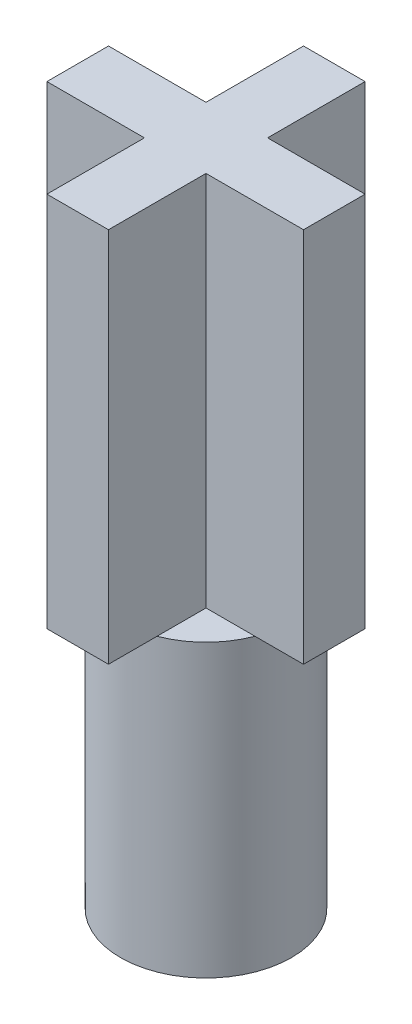
ISO-10303-21;
HEADER;
FILE_DESCRIPTION(('STEP AP214'),'2;1');
FILE_NAME('part.step','',(''),(''),'','','');
FILE_SCHEMA(('AUTOMOTIVE_DESIGN { 1 0 10303 214 1 1 1 1 }'));
ENDSEC;
DATA;
#1=APPLICATION_CONTEXT('core data for automotive mechanical design processes');
#2=APPLICATION_PROTOCOL_DEFINITION('international standard','automotive_design',2000,#1);
#3=PRODUCT_CONTEXT('',#1,'mechanical');
#4=PRODUCT('Part','Part','',(#3));
#5=PRODUCT_RELATED_PRODUCT_CATEGORY('part','',(#4));
#6=PRODUCT_DEFINITION_FORMATION('','',#4);
#7=PRODUCT_DEFINITION_CONTEXT('part definition',#1,'design');
#8=PRODUCT_DEFINITION('design','',#6,#7);
#9=PRODUCT_DEFINITION_SHAPE('','',#8);
#10=(LENGTH_UNIT() NAMED_UNIT(*) SI_UNIT(.MILLI.,.METRE.));
#11=(NAMED_UNIT(*) PLANE_ANGLE_UNIT() SI_UNIT($,.RADIAN.));
#12=(NAMED_UNIT(*) SI_UNIT($,.STERADIAN.) SOLID_ANGLE_UNIT());
#13=UNCERTAINTY_MEASURE_WITH_UNIT(LENGTH_MEASURE(1.E-05),#10,'distance_accuracy_value','');
#14=(GEOMETRIC_REPRESENTATION_CONTEXT(3) GLOBAL_UNCERTAINTY_ASSIGNED_CONTEXT((#13)) GLOBAL_UNIT_ASSIGNED_CONTEXT((#10,
#11,#12)) REPRESENTATION_CONTEXT('',''));
#15=CARTESIAN_POINT('',(0.,0.,0.));
#16=DIRECTION('',(0.,0.,1.));
#17=DIRECTION('',(1.,0.,0.));
#18=AXIS2_PLACEMENT_3D('',#15,#16,#17);
#19=CARTESIAN_POINT('',(0.,17.,0.));
#20=DIRECTION('',(0.,1.,0.));
#21=DIRECTION('',(0.,0.,1.));
#22=AXIS2_PLACEMENT_3D('',#19,#20,#21);
#23=PLANE('',#22);
#24=DIRECTION('',(-1.,0.,0.));
#25=VECTOR('',#24,1.);
#26=CARTESIAN_POINT('',(-1.8,17.,-1.8));
#27=LINE('',#26,#25);
#28=CARTESIAN_POINT('',(-1.8,17.,-1.8));
#29=VERTEX_POINT('',#28);
#30=CARTESIAN_POINT('',(-4.32900489238578,17.,-1.8));
#31=VERTEX_POINT('',#30);
#32=EDGE_CURVE('E57',#29,#31,#27,.T.);
#33=ORIENTED_EDGE('',*,*,#32,.F.);
#34=DIRECTION('',(0.,0.,1.));
#35=VECTOR('',#34,1.);
#36=CARTESIAN_POINT('',(-1.8,17.,-1.8));
#37=LINE('',#36,#35);
#38=CARTESIAN_POINT('',(-1.8,17.,-4.66476151587624));
#39=VERTEX_POINT('',#38);
#40=EDGE_CURVE('E11',#39,#29,#37,.T.);
#41=ORIENTED_EDGE('',*,*,#40,.F.);
#42=CARTESIAN_POINT('',(0.,17.,0.));
#43=DIRECTION('',(0.,1.,0.));
#44=DIRECTION('',(0.,0.,1.));
#45=AXIS2_PLACEMENT_3D('',#42,#43,#44);
#46=CIRCLE('',#45,5.);
#47=CARTESIAN_POINT('',(-4.32900489238578,17.,-2.50194257362154));
#48=VERTEX_POINT('',#47);
#49=EDGE_CURVE('E206',#39,#48,#46,.T.);
#50=ORIENTED_EDGE('',*,*,#49,.T.);
#51=DIRECTION('',(0.,0.,1.));
#52=VECTOR('',#51,1.);
#53=CARTESIAN_POINT('',(-4.32900489238578,17.,-2.50194257362154));
#54=LINE('',#53,#52);
#55=EDGE_CURVE('E217',#48,#31,#54,.T.);
#56=ORIENTED_EDGE('',*,*,#55,.T.);
#57=EDGE_LOOP('',(#33,#41,#50,#56));
#58=FACE_BOUND('',#57,.T.);
#59=ADVANCED_FACE('F39',(#58),#23,.T.);
#60=DIRECTION('',(0.,0.,-1.));
#61=VECTOR('',#60,1.);
#62=CARTESIAN_POINT('',(1.8,17.,-7.5));
#63=LINE('',#62,#61);
#64=CARTESIAN_POINT('',(1.8,17.,-1.8));
#65=VERTEX_POINT('',#64);
#66=CARTESIAN_POINT('',(1.8,17.,-4.66476151587624));
#67=VERTEX_POINT('',#66);
#68=EDGE_CURVE('E64',#65,#67,#63,.T.);
#69=ORIENTED_EDGE('',*,*,#68,.F.);
#70=DIRECTION('',(-1.,0.,0.));
#71=VECTOR('',#70,1.);
#72=CARTESIAN_POINT('',(7.5,17.,-1.8));
#73=LINE('',#72,#71);
#74=CARTESIAN_POINT('',(4.66476151587624,17.,-1.8));
#75=VERTEX_POINT('',#74);
#76=EDGE_CURVE('E48',#75,#65,#73,.T.);
#77=ORIENTED_EDGE('',*,*,#76,.F.);
#78=EDGE_CURVE('E364',#75,#67,#46,.T.);
#79=ORIENTED_EDGE('',*,*,#78,.T.);
#80=EDGE_LOOP('',(#69,#77,#79));
#81=FACE_BOUND('',#80,.T.);
#82=ADVANCED_FACE('F402',(#81),#23,.T.);
#83=DIRECTION('',(1.,0.,0.));
#84=VECTOR('',#83,1.);
#85=CARTESIAN_POINT('',(1.8,17.,1.8));
#86=LINE('',#85,#84);
#87=CARTESIAN_POINT('',(1.8,17.,1.8));
#88=VERTEX_POINT('',#87);
#89=CARTESIAN_POINT('',(4.66476151587624,17.,1.8));
#90=VERTEX_POINT('',#89);
#91=EDGE_CURVE('E303',#88,#90,#86,.T.);
#92=ORIENTED_EDGE('',*,*,#91,.F.);
#93=DIRECTION('',(0.,0.,-1.));
#94=VECTOR('',#93,1.);
#95=CARTESIAN_POINT('',(1.8,17.,1.8));
#96=LINE('',#95,#94);
#97=CARTESIAN_POINT('',(1.8,17.,4.66476151587624));
#98=VERTEX_POINT('',#97);
#99=EDGE_CURVE('E287',#98,#88,#96,.T.);
#100=ORIENTED_EDGE('',*,*,#99,.F.);
#101=EDGE_CURVE('E358',#98,#90,#46,.T.);
#102=ORIENTED_EDGE('',*,*,#101,.T.);
#103=EDGE_LOOP('',(#92,#100,#102));
#104=FACE_BOUND('',#103,.T.);
#105=ADVANCED_FACE('F400',(#104),#23,.T.);
#106=CARTESIAN_POINT('',(-4.32900489238578,15.,0.));
#107=DIRECTION('',(1.,0.,0.));
#108=DIRECTION('',(0.,0.,-1.));
#109=AXIS2_PLACEMENT_3D('',#106,#107,#108);
#110=PLANE('',#109);
#111=DIRECTION('',(0.,0.,1.));
#112=VECTOR('',#111,1.);
#113=CARTESIAN_POINT('',(-4.32900489238578,0.,0.));
#114=LINE('',#113,#112);
#115=CARTESIAN_POINT('',(-4.32900489238578,0.,-2.50194257362154));
#116=VERTEX_POINT('',#115);
#117=CARTESIAN_POINT('',(-4.32900489238578,0.,2.50194257362154));
#118=VERTEX_POINT('',#117);
#119=EDGE_CURVE('E234',#116,#118,#114,.T.);
#120=ORIENTED_EDGE('',*,*,#119,.T.);
#121=DIRECTION('',(0.,-1.,0.));
#122=VECTOR('',#121,1.);
#123=CARTESIAN_POINT('',(-4.32900489238578,15.,2.50194257362154));
#124=LINE('',#123,#122);
#125=CARTESIAN_POINT('',(-4.32900489238578,17.,2.50194257362154));
#126=VERTEX_POINT('',#125);
#127=EDGE_CURVE('E241',#126,#118,#124,.T.);
#128=ORIENTED_EDGE('',*,*,#127,.F.);
#129=CARTESIAN_POINT('',(-4.32900489238578,17.,1.8));
#130=VERTEX_POINT('',#129);
#131=EDGE_CURVE('E215',#130,#126,#54,.T.);
#132=ORIENTED_EDGE('',*,*,#131,.F.);
#133=EDGE_CURVE('E220',#31,#130,#54,.T.);
#134=ORIENTED_EDGE('',*,*,#133,.F.);
#135=ORIENTED_EDGE('',*,*,#55,.F.);
#136=DIRECTION('',(0.,-1.,0.));
#137=VECTOR('',#136,1.);
#138=CARTESIAN_POINT('',(-4.32900489238578,15.,-2.50194257362154));
#139=LINE('',#138,#137);
#140=EDGE_CURVE('E238',#48,#116,#139,.T.);
#141=ORIENTED_EDGE('',*,*,#140,.T.);
#142=EDGE_LOOP('',(#120,#128,#132,#134,#135,#141));
#143=FACE_BOUND('',#142,.T.);
#144=ADVANCED_FACE('F261',(#143),#110,.F.);
#145=CARTESIAN_POINT('',(0.,15.,0.));
#146=DIRECTION('',(0.,-1.,0.));
#147=DIRECTION('',(0.,0.,-1.));
#148=AXIS2_PLACEMENT_3D('',#145,#146,#147);
#149=CYLINDRICAL_SURFACE('',#148,2.65);
#150=CARTESIAN_POINT('',(0.,0.,0.));
#151=DIRECTION('',(0.,1.,0.));
#152=DIRECTION('',(0.,0.,1.));
#153=AXIS2_PLACEMENT_3D('',#150,#151,#152);
#154=CIRCLE('',#153,2.65);
#155=CARTESIAN_POINT('',(-1.47222222222222,0.,2.20342046110021));
#156=VERTEX_POINT('',#155);
#157=CARTESIAN_POINT('',(-1.47222222222222,0.,-2.20342046110021));
#158=VERTEX_POINT('',#157);
#159=EDGE_CURVE('E219',#156,#158,#154,.T.);
#160=ORIENTED_EDGE('',*,*,#159,.F.);
#161=DIRECTION('',(0.,-1.,0.));
#162=VECTOR('',#161,1.);
#163=CARTESIAN_POINT('',(-1.47222222222222,15.,2.20342046110021));
#164=LINE('',#163,#162);
#165=CARTESIAN_POINT('',(-1.47222222222222,15.,2.20342046110021));
#166=VERTEX_POINT('',#165);
#167=EDGE_CURVE('E43',#166,#156,#164,.T.);
#168=ORIENTED_EDGE('',*,*,#167,.F.);
#169=CARTESIAN_POINT('',(0.,15.,0.));
#170=DIRECTION('',(0.,1.,0.));
#171=DIRECTION('',(0.,0.,1.));
#172=AXIS2_PLACEMENT_3D('',#169,#170,#171);
#173=CIRCLE('',#172,2.65);
#174=CARTESIAN_POINT('',(-1.47222222222222,15.,-2.20342046110021));
#175=VERTEX_POINT('',#174);
#176=EDGE_CURVE('E221',#166,#175,#173,.T.);
#177=ORIENTED_EDGE('',*,*,#176,.T.);
#178=DIRECTION('',(0.,-1.,0.));
#179=VECTOR('',#178,1.);
#180=CARTESIAN_POINT('',(-1.47222222222222,15.,-2.20342046110021));
#181=LINE('',#180,#179);
#182=EDGE_CURVE('E228',#175,#158,#181,.T.);
#183=ORIENTED_EDGE('',*,*,#182,.T.);
#184=EDGE_LOOP('',(#160,#168,#177,#183));
#185=FACE_BOUND('',#184,.T.);
#186=ADVANCED_FACE('F41',(#185),#149,.F.);
#187=CARTESIAN_POINT('',(-1.47222222222222,15.,0.));
#188=DIRECTION('',(1.,0.,0.));
#189=DIRECTION('',(0.,0.,-1.));
#190=AXIS2_PLACEMENT_3D('',#187,#188,#189);
#191=PLANE('',#190);
#192=DIRECTION('',(0.,0.,1.));
#193=VECTOR('',#192,1.);
#194=CARTESIAN_POINT('',(-1.47222222222222,0.,0.));
#195=LINE('',#194,#193);
#196=EDGE_CURVE('E231',#158,#156,#195,.T.);
#197=ORIENTED_EDGE('',*,*,#196,.F.);
#198=ORIENTED_EDGE('',*,*,#182,.F.);
#199=DIRECTION('',(0.,0.,1.));
#200=VECTOR('',#199,1.);
#201=CARTESIAN_POINT('',(-1.47222222222222,15.,0.));
#202=LINE('',#201,#200);
#203=EDGE_CURVE('E224',#175,#166,#202,.T.);
#204=ORIENTED_EDGE('',*,*,#203,.T.);
#205=ORIENTED_EDGE('',*,*,#167,.T.);
#206=EDGE_LOOP('',(#197,#198,#204,#205));
#207=FACE_BOUND('',#206,.T.);
#208=ADVANCED_FACE('F250',(#207),#191,.T.);
#209=CARTESIAN_POINT('',(0.,15.,0.));
#210=DIRECTION('',(0.,-1.,0.));
#211=DIRECTION('',(0.,0.,-1.));
#212=AXIS2_PLACEMENT_3D('',#209,#210,#211);
#213=CYLINDRICAL_SURFACE('',#212,5.);
#214=CARTESIAN_POINT('',(0.,0.,0.));
#215=DIRECTION('',(0.,1.,0.));
#216=DIRECTION('',(0.,0.,1.));
#217=AXIS2_PLACEMENT_3D('',#214,#215,#216);
#218=CIRCLE('',#217,5.);
#219=EDGE_CURVE('E225',#118,#116,#218,.T.);
#220=ORIENTED_EDGE('',*,*,#219,.T.);
#221=ORIENTED_EDGE('',*,*,#140,.F.);
#222=ORIENTED_EDGE('',*,*,#49,.F.);
#223=EDGE_CURVE('E208',#67,#39,#46,.T.);
#224=ORIENTED_EDGE('',*,*,#223,.F.);
#225=ORIENTED_EDGE('',*,*,#78,.F.);
#226=EDGE_CURVE('E360',#90,#75,#46,.T.);
#227=ORIENTED_EDGE('',*,*,#226,.F.);
#228=ORIENTED_EDGE('',*,*,#101,.F.);
#229=CARTESIAN_POINT('',(-1.8,17.,4.66476151587624));
#230=VERTEX_POINT('',#229);
#231=EDGE_CURVE('E216',#230,#98,#46,.T.);
#232=ORIENTED_EDGE('',*,*,#231,.F.);
#233=EDGE_CURVE('E210',#126,#230,#46,.T.);
#234=ORIENTED_EDGE('',*,*,#233,.F.);
#235=ORIENTED_EDGE('',*,*,#127,.T.);
#236=EDGE_LOOP('',(#220,#221,#222,#224,#225,#227,#228,#232,#234,#235));
#237=FACE_BOUND('',#236,.T.);
#238=ADVANCED_FACE('F256',(#237),#213,.T.);
#239=CARTESIAN_POINT('',(0.,0.,0.));
#240=DIRECTION('',(0.,1.,0.));
#241=DIRECTION('',(0.,0.,1.));
#242=AXIS2_PLACEMENT_3D('',#239,#240,#241);
#243=PLANE('',#242);
#244=ORIENTED_EDGE('',*,*,#159,.T.);
#245=ORIENTED_EDGE('',*,*,#196,.T.);
#246=EDGE_LOOP('',(#244,#245));
#247=FACE_BOUND('',#246,.T.);
#248=ORIENTED_EDGE('',*,*,#119,.F.);
#249=ORIENTED_EDGE('',*,*,#219,.F.);
#250=EDGE_LOOP('',(#248,#249));
#251=FACE_BOUND('',#250,.T.);
#252=ADVANCED_FACE('F252',(#247,#251),#243,.F.);
#253=CARTESIAN_POINT('',(0.,15.,0.));
#254=DIRECTION('',(0.,1.,0.));
#255=DIRECTION('',(0.,0.,1.));
#256=AXIS2_PLACEMENT_3D('',#253,#254,#255);
#257=PLANE('',#256);
#258=ORIENTED_EDGE('',*,*,#176,.F.);
#259=ORIENTED_EDGE('',*,*,#203,.F.);
#260=EDGE_LOOP('',(#258,#259));
#261=FACE_BOUND('',#260,.T.);
#262=ADVANCED_FACE('F255',(#261),#257,.F.);
#263=DIRECTION('',(1.,0.,0.));
#264=VECTOR('',#263,1.);
#265=CARTESIAN_POINT('',(-7.5,17.,1.8));
#266=LINE('',#265,#264);
#267=CARTESIAN_POINT('',(-1.8,17.,1.8));
#268=VERTEX_POINT('',#267);
#269=EDGE_CURVE('E243',#130,#268,#266,.T.);
#270=ORIENTED_EDGE('',*,*,#269,.F.);
#271=ORIENTED_EDGE('',*,*,#131,.T.);
#272=ORIENTED_EDGE('',*,*,#233,.T.);
#273=DIRECTION('',(0.,0.,1.));
#274=VECTOR('',#273,1.);
#275=CARTESIAN_POINT('',(-1.8,17.,7.5));
#276=LINE('',#275,#274);
#277=EDGE_CURVE('E276',#268,#230,#276,.T.);
#278=ORIENTED_EDGE('',*,*,#277,.F.);
#279=EDGE_LOOP('',(#270,#271,#272,#278));
#280=FACE_BOUND('',#279,.T.);
#281=ADVANCED_FACE('F274',(#280),#23,.T.);
#282=CARTESIAN_POINT('',(0.,17.,0.));
#283=DIRECTION('',(0.,1.,0.));
#284=DIRECTION('',(0.,0.,1.));
#285=AXIS2_PLACEMENT_3D('',#282,#283,#284);
#286=PLANE('',#285);
#287=CARTESIAN_POINT('',(-1.8,17.,7.5));
#288=VERTEX_POINT('',#287);
#289=EDGE_CURVE('E283',#230,#288,#276,.T.);
#290=ORIENTED_EDGE('',*,*,#289,.F.);
#291=ORIENTED_EDGE('',*,*,#231,.T.);
#292=CARTESIAN_POINT('',(1.8,17.,7.5));
#293=VERTEX_POINT('',#292);
#294=EDGE_CURVE('E290',#293,#98,#96,.T.);
#295=ORIENTED_EDGE('',*,*,#294,.F.);
#296=DIRECTION('',(1.,0.,0.));
#297=VECTOR('',#296,1.);
#298=CARTESIAN_POINT('',(1.8,17.,7.5));
#299=LINE('',#298,#297);
#300=EDGE_CURVE('E300',#288,#293,#299,.T.);
#301=ORIENTED_EDGE('',*,*,#300,.F.);
#302=EDGE_LOOP('',(#290,#291,#295,#301));
#303=FACE_BOUND('',#302,.T.);
#304=ADVANCED_FACE('F357',(#303),#286,.F.);
#305=CARTESIAN_POINT('',(7.5,17.,1.8));
#306=VERTEX_POINT('',#305);
#307=EDGE_CURVE('E299',#90,#306,#86,.T.);
#308=ORIENTED_EDGE('',*,*,#307,.F.);
#309=ORIENTED_EDGE('',*,*,#226,.T.);
#310=CARTESIAN_POINT('',(7.5,17.,-1.8));
#311=VERTEX_POINT('',#310);
#312=EDGE_CURVE('E296',#311,#75,#73,.T.);
#313=ORIENTED_EDGE('',*,*,#312,.F.);
#314=DIRECTION('',(0.,0.,-1.));
#315=VECTOR('',#314,1.);
#316=CARTESIAN_POINT('',(7.5,17.,1.8));
#317=LINE('',#316,#315);
#318=EDGE_CURVE('E393',#306,#311,#317,.T.);
#319=ORIENTED_EDGE('',*,*,#318,.F.);
#320=EDGE_LOOP('',(#308,#309,#313,#319));
#321=FACE_BOUND('',#320,.T.);
#322=ADVANCED_FACE('F463',(#321),#286,.F.);
#323=CARTESIAN_POINT('',(1.8,17.,-7.5));
#324=VERTEX_POINT('',#323);
#325=EDGE_CURVE('E375',#67,#324,#63,.T.);
#326=ORIENTED_EDGE('',*,*,#325,.F.);
#327=ORIENTED_EDGE('',*,*,#223,.T.);
#328=CARTESIAN_POINT('',(-1.8,17.,-7.5));
#329=VERTEX_POINT('',#328);
#330=EDGE_CURVE('E50',#329,#39,#37,.T.);
#331=ORIENTED_EDGE('',*,*,#330,.F.);
#332=DIRECTION('',(-1.,0.,0.));
#333=VECTOR('',#332,1.);
#334=CARTESIAN_POINT('',(0.,17.,-7.5));
#335=LINE('',#334,#333);
#336=EDGE_CURVE('E381',#324,#329,#335,.T.);
#337=ORIENTED_EDGE('',*,*,#336,.F.);
#338=EDGE_LOOP('',(#326,#327,#331,#337));
#339=FACE_BOUND('',#338,.T.);
#340=ADVANCED_FACE('F373',(#339),#286,.F.);
#341=CARTESIAN_POINT('',(-7.5,17.,-1.8));
#342=VERTEX_POINT('',#341);
#343=EDGE_CURVE('E282',#31,#342,#27,.T.);
#344=ORIENTED_EDGE('',*,*,#343,.F.);
#345=ORIENTED_EDGE('',*,*,#133,.T.);
#346=CARTESIAN_POINT('',(-7.5,17.,1.8));
#347=VERTEX_POINT('',#346);
#348=EDGE_CURVE('E281',#347,#130,#266,.T.);
#349=ORIENTED_EDGE('',*,*,#348,.F.);
#350=DIRECTION('',(0.,0.,1.));
#351=VECTOR('',#350,1.);
#352=CARTESIAN_POINT('',(-7.5,17.,0.));
#353=LINE('',#352,#351);
#354=EDGE_CURVE('E201',#342,#347,#353,.T.);
#355=ORIENTED_EDGE('',*,*,#354,.F.);
#356=EDGE_LOOP('',(#344,#345,#349,#355));
#357=FACE_BOUND('',#356,.T.);
#358=ADVANCED_FACE('F280',(#357),#286,.F.);
#359=CARTESIAN_POINT('',(-7.5,39.,1.8));
#360=DIRECTION('',(0.,0.,-1.));
#361=DIRECTION('',(-1.,0.,0.));
#362=AXIS2_PLACEMENT_3D('',#359,#360,#361);
#363=PLANE('',#362);
#364=ORIENTED_EDGE('',*,*,#348,.T.);
#365=ORIENTED_EDGE('',*,*,#269,.T.);
#366=DIRECTION('',(0.,-1.,0.));
#367=VECTOR('',#366,1.);
#368=CARTESIAN_POINT('',(-1.8,39.,1.8));
#369=LINE('',#368,#367);
#370=CARTESIAN_POINT('',(-1.8,39.,1.8));
#371=VERTEX_POINT('',#370);
#372=EDGE_CURVE('E188',#371,#268,#369,.T.);
#373=ORIENTED_EDGE('',*,*,#372,.F.);
#374=DIRECTION('',(1.,0.,0.));
#375=VECTOR('',#374,1.);
#376=CARTESIAN_POINT('',(-7.5,39.,1.8));
#377=LINE('',#376,#375);
#378=CARTESIAN_POINT('',(-7.5,39.,1.8));
#379=VERTEX_POINT('',#378);
#380=EDGE_CURVE('E180',#379,#371,#377,.T.);
#381=ORIENTED_EDGE('',*,*,#380,.F.);
#382=DIRECTION('',(0.,-1.,0.));
#383=VECTOR('',#382,1.);
#384=CARTESIAN_POINT('',(-7.5,39.,1.8));
#385=LINE('',#384,#383);
#386=EDGE_CURVE('E185',#379,#347,#385,.T.);
#387=ORIENTED_EDGE('',*,*,#386,.T.);
#388=EDGE_LOOP('',(#364,#365,#373,#381,#387));
#389=FACE_BOUND('',#388,.T.);
#390=ADVANCED_FACE('F183',(#389),#363,.F.);
#391=CARTESIAN_POINT('',(-1.8,39.,7.5));
#392=DIRECTION('',(1.,0.,0.));
#393=DIRECTION('',(0.,0.,-1.));
#394=AXIS2_PLACEMENT_3D('',#391,#392,#393);
#395=PLANE('',#394);
#396=ORIENTED_EDGE('',*,*,#277,.T.);
#397=ORIENTED_EDGE('',*,*,#289,.T.);
#398=DIRECTION('',(0.,-1.,0.));
#399=VECTOR('',#398,1.);
#400=CARTESIAN_POINT('',(-1.8,39.,7.5));
#401=LINE('',#400,#399);
#402=CARTESIAN_POINT('',(-1.8,39.,7.5));
#403=VERTEX_POINT('',#402);
#404=EDGE_CURVE('E211',#403,#288,#401,.T.);
#405=ORIENTED_EDGE('',*,*,#404,.F.);
#406=DIRECTION('',(0.,0.,1.));
#407=VECTOR('',#406,1.);
#408=CARTESIAN_POINT('',(-1.8,39.,7.5));
#409=LINE('',#408,#407);
#410=EDGE_CURVE('E191',#371,#403,#409,.T.);
#411=ORIENTED_EDGE('',*,*,#410,.F.);
#412=ORIENTED_EDGE('',*,*,#372,.T.);
#413=EDGE_LOOP('',(#396,#397,#405,#411,#412));
#414=FACE_BOUND('',#413,.T.);
#415=ADVANCED_FACE('F309',(#414),#395,.F.);
#416=CARTESIAN_POINT('',(1.8,39.,7.5));
#417=DIRECTION('',(0.,0.,-1.));
#418=DIRECTION('',(-1.,0.,0.));
#419=AXIS2_PLACEMENT_3D('',#416,#417,#418);
#420=PLANE('',#419);
#421=ORIENTED_EDGE('',*,*,#300,.T.);
#422=DIRECTION('',(0.,-1.,0.));
#423=VECTOR('',#422,1.);
#424=CARTESIAN_POINT('',(1.8,39.,7.5));
#425=LINE('',#424,#423);
#426=CARTESIAN_POINT('',(1.8,39.,7.5));
#427=VERTEX_POINT('',#426);
#428=EDGE_CURVE('E354',#427,#293,#425,.T.);
#429=ORIENTED_EDGE('',*,*,#428,.F.);
#430=DIRECTION('',(1.,0.,0.));
#431=VECTOR('',#430,1.);
#432=CARTESIAN_POINT('',(1.8,39.,7.5));
#433=LINE('',#432,#431);
#434=EDGE_CURVE('E312',#403,#427,#433,.T.);
#435=ORIENTED_EDGE('',*,*,#434,.F.);
#436=ORIENTED_EDGE('',*,*,#404,.T.);
#437=EDGE_LOOP('',(#421,#429,#435,#436));
#438=FACE_BOUND('',#437,.T.);
#439=ADVANCED_FACE('F355',(#438),#420,.F.);
#440=CARTESIAN_POINT('',(1.8,39.,1.8));
#441=DIRECTION('',(-1.,0.,0.));
#442=DIRECTION('',(0.,0.,1.));
#443=AXIS2_PLACEMENT_3D('',#440,#441,#442);
#444=PLANE('',#443);
#445=ORIENTED_EDGE('',*,*,#294,.T.);
#446=ORIENTED_EDGE('',*,*,#99,.T.);
#447=DIRECTION('',(0.,-1.,0.));
#448=VECTOR('',#447,1.);
#449=CARTESIAN_POINT('',(1.8,39.,1.8));
#450=LINE('',#449,#448);
#451=CARTESIAN_POINT('',(1.8,39.,1.8));
#452=VERTEX_POINT('',#451);
#453=EDGE_CURVE('E352',#452,#88,#450,.T.);
#454=ORIENTED_EDGE('',*,*,#453,.F.);
#455=DIRECTION('',(0.,0.,-1.));
#456=VECTOR('',#455,1.);
#457=CARTESIAN_POINT('',(1.8,39.,1.8));
#458=LINE('',#457,#456);
#459=EDGE_CURVE('E314',#427,#452,#458,.T.);
#460=ORIENTED_EDGE('',*,*,#459,.F.);
#461=ORIENTED_EDGE('',*,*,#428,.T.);
#462=EDGE_LOOP('',(#445,#446,#454,#460,#461));
#463=FACE_BOUND('',#462,.T.);
#464=ADVANCED_FACE('F514',(#463),#444,.F.);
#465=CARTESIAN_POINT('',(1.8,39.,1.8));
#466=DIRECTION('',(0.,0.,-1.));
#467=DIRECTION('',(-1.,0.,0.));
#468=AXIS2_PLACEMENT_3D('',#465,#466,#467);
#469=PLANE('',#468);
#470=ORIENTED_EDGE('',*,*,#91,.T.);
#471=ORIENTED_EDGE('',*,*,#307,.T.);
#472=DIRECTION('',(0.,-1.,0.));
#473=VECTOR('',#472,1.);
#474=CARTESIAN_POINT('',(7.5,39.,1.8));
#475=LINE('',#474,#473);
#476=CARTESIAN_POINT('',(7.5,39.,1.8));
#477=VERTEX_POINT('',#476);
#478=EDGE_CURVE('E349',#477,#306,#475,.T.);
#479=ORIENTED_EDGE('',*,*,#478,.F.);
#480=DIRECTION('',(1.,0.,0.));
#481=VECTOR('',#480,1.);
#482=CARTESIAN_POINT('',(1.8,39.,1.8));
#483=LINE('',#482,#481);
#484=EDGE_CURVE('E318',#452,#477,#483,.T.);
#485=ORIENTED_EDGE('',*,*,#484,.F.);
#486=ORIENTED_EDGE('',*,*,#453,.T.);
#487=EDGE_LOOP('',(#470,#471,#479,#485,#486));
#488=FACE_BOUND('',#487,.T.);
#489=ADVANCED_FACE('F397',(#488),#469,.F.);
#490=CARTESIAN_POINT('',(7.5,39.,1.8));
#491=DIRECTION('',(-1.,0.,0.));
#492=DIRECTION('',(0.,0.,1.));
#493=AXIS2_PLACEMENT_3D('',#490,#491,#492);
#494=PLANE('',#493);
#495=ORIENTED_EDGE('',*,*,#318,.T.);
#496=DIRECTION('',(0.,-1.,0.));
#497=VECTOR('',#496,1.);
#498=CARTESIAN_POINT('',(7.5,39.,-1.8));
#499=LINE('',#498,#497);
#500=CARTESIAN_POINT('',(7.5,39.,-1.8));
#501=VERTEX_POINT('',#500);
#502=EDGE_CURVE('E346',#501,#311,#499,.T.);
#503=ORIENTED_EDGE('',*,*,#502,.F.);
#504=DIRECTION('',(0.,0.,-1.));
#505=VECTOR('',#504,1.);
#506=CARTESIAN_POINT('',(7.5,39.,1.8));
#507=LINE('',#506,#505);
#508=EDGE_CURVE('E320',#477,#501,#507,.T.);
#509=ORIENTED_EDGE('',*,*,#508,.F.);
#510=ORIENTED_EDGE('',*,*,#478,.T.);
#511=EDGE_LOOP('',(#495,#503,#509,#510));
#512=FACE_BOUND('',#511,.T.);
#513=ADVANCED_FACE('F533',(#512),#494,.F.);
#514=CARTESIAN_POINT('',(7.5,39.,-1.8));
#515=DIRECTION('',(0.,0.,1.));
#516=DIRECTION('',(1.,0.,0.));
#517=AXIS2_PLACEMENT_3D('',#514,#515,#516);
#518=PLANE('',#517);
#519=ORIENTED_EDGE('',*,*,#312,.T.);
#520=ORIENTED_EDGE('',*,*,#76,.T.);
#521=DIRECTION('',(0.,-1.,0.));
#522=VECTOR('',#521,1.);
#523=CARTESIAN_POINT('',(1.8,39.,-1.8));
#524=LINE('',#523,#522);
#525=CARTESIAN_POINT('',(1.8,39.,-1.8));
#526=VERTEX_POINT('',#525);
#527=EDGE_CURVE('E343',#526,#65,#524,.T.);
#528=ORIENTED_EDGE('',*,*,#527,.F.);
#529=DIRECTION('',(-1.,0.,0.));
#530=VECTOR('',#529,1.);
#531=CARTESIAN_POINT('',(7.5,39.,-1.8));
#532=LINE('',#531,#530);
#533=EDGE_CURVE('E322',#501,#526,#532,.T.);
#534=ORIENTED_EDGE('',*,*,#533,.F.);
#535=ORIENTED_EDGE('',*,*,#502,.T.);
#536=EDGE_LOOP('',(#519,#520,#528,#534,#535));
#537=FACE_BOUND('',#536,.T.);
#538=ADVANCED_FACE('F543',(#537),#518,.F.);
#539=CARTESIAN_POINT('',(1.8,39.,-7.5));
#540=DIRECTION('',(-1.,0.,0.));
#541=DIRECTION('',(0.,0.,1.));
#542=AXIS2_PLACEMENT_3D('',#539,#540,#541);
#543=PLANE('',#542);
#544=ORIENTED_EDGE('',*,*,#68,.T.);
#545=ORIENTED_EDGE('',*,*,#325,.T.);
#546=DIRECTION('',(0.,-1.,0.));
#547=VECTOR('',#546,1.);
#548=CARTESIAN_POINT('',(1.8,39.,-7.5));
#549=LINE('',#548,#547);
#550=CARTESIAN_POINT('',(1.8,39.,-7.5));
#551=VERTEX_POINT('',#550);
#552=EDGE_CURVE('E340',#551,#324,#549,.T.);
#553=ORIENTED_EDGE('',*,*,#552,.F.);
#554=DIRECTION('',(0.,0.,-1.));
#555=VECTOR('',#554,1.);
#556=CARTESIAN_POINT('',(1.8,39.,-7.5));
#557=LINE('',#556,#555);
#558=EDGE_CURVE('E324',#526,#551,#557,.T.);
#559=ORIENTED_EDGE('',*,*,#558,.F.);
#560=ORIENTED_EDGE('',*,*,#527,.T.);
#561=EDGE_LOOP('',(#544,#545,#553,#559,#560));
#562=FACE_BOUND('',#561,.T.);
#563=ADVANCED_FACE('F392',(#562),#543,.F.);
#564=CARTESIAN_POINT('',(0.,39.,-7.5));
#565=DIRECTION('',(0.,0.,1.));
#566=DIRECTION('',(1.,0.,0.));
#567=AXIS2_PLACEMENT_3D('',#564,#565,#566);
#568=PLANE('',#567);
#569=ORIENTED_EDGE('',*,*,#336,.T.);
#570=DIRECTION('',(0.,-1.,0.));
#571=VECTOR('',#570,1.);
#572=CARTESIAN_POINT('',(-1.8,39.,-7.5));
#573=LINE('',#572,#571);
#574=CARTESIAN_POINT('',(-1.8,39.,-7.5));
#575=VERTEX_POINT('',#574);
#576=EDGE_CURVE('E333',#575,#329,#573,.T.);
#577=ORIENTED_EDGE('',*,*,#576,.F.);
#578=DIRECTION('',(-1.,0.,0.));
#579=VECTOR('',#578,1.);
#580=CARTESIAN_POINT('',(0.,39.,-7.5));
#581=LINE('',#580,#579);
#582=EDGE_CURVE('E326',#551,#575,#581,.T.);
#583=ORIENTED_EDGE('',*,*,#582,.F.);
#584=ORIENTED_EDGE('',*,*,#552,.T.);
#585=EDGE_LOOP('',(#569,#577,#583,#584));
#586=FACE_BOUND('',#585,.T.);
#587=ADVANCED_FACE('F390',(#586),#568,.F.);
#588=CARTESIAN_POINT('',(-1.8,39.,-1.8));
#589=DIRECTION('',(1.,0.,0.));
#590=DIRECTION('',(0.,0.,-1.));
#591=AXIS2_PLACEMENT_3D('',#588,#589,#590);
#592=PLANE('',#591);
#593=ORIENTED_EDGE('',*,*,#330,.T.);
#594=ORIENTED_EDGE('',*,*,#40,.T.);
#595=DIRECTION('',(0.,-1.,0.));
#596=VECTOR('',#595,1.);
#597=CARTESIAN_POINT('',(-1.8,39.,-1.8));
#598=LINE('',#597,#596);
#599=CARTESIAN_POINT('',(-1.8,39.,-1.8));
#600=VERTEX_POINT('',#599);
#601=EDGE_CURVE('E330',#600,#29,#598,.T.);
#602=ORIENTED_EDGE('',*,*,#601,.F.);
#603=DIRECTION('',(0.,0.,1.));
#604=VECTOR('',#603,1.);
#605=CARTESIAN_POINT('',(-1.8,39.,-1.8));
#606=LINE('',#605,#604);
#607=EDGE_CURVE('E328',#575,#600,#606,.T.);
#608=ORIENTED_EDGE('',*,*,#607,.F.);
#609=ORIENTED_EDGE('',*,*,#576,.T.);
#610=EDGE_LOOP('',(#593,#594,#602,#608,#609));
#611=FACE_BOUND('',#610,.T.);
#612=ADVANCED_FACE('F377',(#611),#592,.F.);
#613=CARTESIAN_POINT('',(-1.8,39.,-1.8));
#614=DIRECTION('',(0.,0.,1.));
#615=DIRECTION('',(1.,0.,0.));
#616=AXIS2_PLACEMENT_3D('',#613,#614,#615);
#617=PLANE('',#616);
#618=ORIENTED_EDGE('',*,*,#32,.T.);
#619=ORIENTED_EDGE('',*,*,#343,.T.);
#620=DIRECTION('',(0.,-1.,0.));
#621=VECTOR('',#620,1.);
#622=CARTESIAN_POINT('',(-7.5,39.,-1.8));
#623=LINE('',#622,#621);
#624=CARTESIAN_POINT('',(-7.5,39.,-1.8));
#625=VERTEX_POINT('',#624);
#626=EDGE_CURVE('E329',#625,#342,#623,.T.);
#627=ORIENTED_EDGE('',*,*,#626,.F.);
#628=DIRECTION('',(-1.,0.,0.));
#629=VECTOR('',#628,1.);
#630=CARTESIAN_POINT('',(-1.8,39.,-1.8));
#631=LINE('',#630,#629);
#632=EDGE_CURVE('E197',#600,#625,#631,.T.);
#633=ORIENTED_EDGE('',*,*,#632,.F.);
#634=ORIENTED_EDGE('',*,*,#601,.T.);
#635=EDGE_LOOP('',(#618,#619,#627,#633,#634));
#636=FACE_BOUND('',#635,.T.);
#637=ADVANCED_FACE('F385',(#636),#617,.F.);
#638=CARTESIAN_POINT('',(-7.5,39.,0.));
#639=DIRECTION('',(1.,0.,0.));
#640=DIRECTION('',(0.,0.,-1.));
#641=AXIS2_PLACEMENT_3D('',#638,#639,#640);
#642=PLANE('',#641);
#643=ORIENTED_EDGE('',*,*,#354,.T.);
#644=ORIENTED_EDGE('',*,*,#386,.F.);
#645=DIRECTION('',(0.,0.,1.));
#646=VECTOR('',#645,1.);
#647=CARTESIAN_POINT('',(-7.5,39.,0.));
#648=LINE('',#647,#646);
#649=EDGE_CURVE('E192',#625,#379,#648,.T.);
#650=ORIENTED_EDGE('',*,*,#649,.F.);
#651=ORIENTED_EDGE('',*,*,#626,.T.);
#652=EDGE_LOOP('',(#643,#644,#650,#651));
#653=FACE_BOUND('',#652,.T.);
#654=ADVANCED_FACE('F203',(#653),#642,.F.);
#655=CARTESIAN_POINT('',(0.,39.,0.));
#656=DIRECTION('',(0.,1.,0.));
#657=DIRECTION('',(0.,0.,1.));
#658=AXIS2_PLACEMENT_3D('',#655,#656,#657);
#659=PLANE('',#658);
#660=ORIENTED_EDGE('',*,*,#649,.T.);
#661=ORIENTED_EDGE('',*,*,#380,.T.);
#662=ORIENTED_EDGE('',*,*,#410,.T.);
#663=ORIENTED_EDGE('',*,*,#434,.T.);
#664=ORIENTED_EDGE('',*,*,#459,.T.);
#665=ORIENTED_EDGE('',*,*,#484,.T.);
#666=ORIENTED_EDGE('',*,*,#508,.T.);
#667=ORIENTED_EDGE('',*,*,#533,.T.);
#668=ORIENTED_EDGE('',*,*,#558,.T.);
#669=ORIENTED_EDGE('',*,*,#582,.T.);
#670=ORIENTED_EDGE('',*,*,#607,.T.);
#671=ORIENTED_EDGE('',*,*,#632,.T.);
#672=EDGE_LOOP('',(#660,#661,#662,#663,#664,#665,#666,#667,#668,#669,#670,#671));
#673=FACE_BOUND('',#672,.T.);
#674=ADVANCED_FACE('F195',(#673),#659,.T.);
#675=CLOSED_SHELL('',(#59,#82,#105,#144,#186,#208,#238,#252,#262,#281,#304,#322,#340,#358,#390,
#415,#439,#464,#489,#513,#538,#563,#587,#612,#637,#654,#674));
#676=MANIFOLD_SOLID_BREP('B2',#675);
#677=ADVANCED_BREP_SHAPE_REPRESENTATION('',(#18,#676),#14);
#678=SHAPE_DEFINITION_REPRESENTATION(#9,#677);
ENDSEC;
END-ISO-10303-21;
